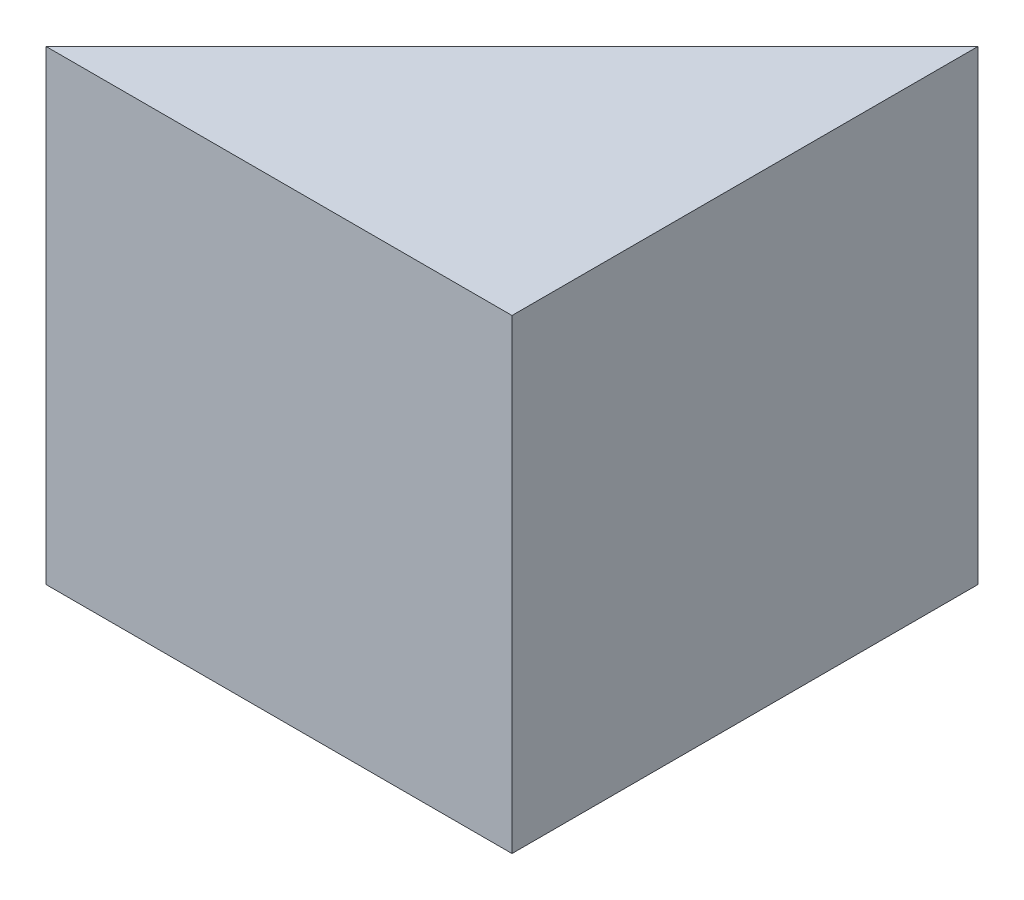
ISO-10303-21;
HEADER;
FILE_DESCRIPTION(('STEP AP214'),'2;1');
FILE_NAME('part.step','',(''),(''),'','','');
FILE_SCHEMA(('AUTOMOTIVE_DESIGN { 1 0 10303 214 1 1 1 1 }'));
ENDSEC;
DATA;
#1=APPLICATION_CONTEXT('core data for automotive mechanical design processes');
#2=APPLICATION_PROTOCOL_DEFINITION('international standard','automotive_design',2000,#1);
#3=PRODUCT_CONTEXT('',#1,'mechanical');
#4=PRODUCT('Part','Part','',(#3));
#5=PRODUCT_RELATED_PRODUCT_CATEGORY('part','',(#4));
#6=PRODUCT_DEFINITION_FORMATION('','',#4);
#7=PRODUCT_DEFINITION_CONTEXT('part definition',#1,'design');
#8=PRODUCT_DEFINITION('design','',#6,#7);
#9=PRODUCT_DEFINITION_SHAPE('','',#8);
#10=(LENGTH_UNIT() NAMED_UNIT(*) SI_UNIT(.MILLI.,.METRE.));
#11=(NAMED_UNIT(*) PLANE_ANGLE_UNIT() SI_UNIT($,.RADIAN.));
#12=(NAMED_UNIT(*) SI_UNIT($,.STERADIAN.) SOLID_ANGLE_UNIT());
#13=UNCERTAINTY_MEASURE_WITH_UNIT(LENGTH_MEASURE(1.E-05),#10,'distance_accuracy_value','');
#14=(GEOMETRIC_REPRESENTATION_CONTEXT(3) GLOBAL_UNCERTAINTY_ASSIGNED_CONTEXT((#13)) GLOBAL_UNIT_ASSIGNED_CONTEXT((#10,
#11,#12)) REPRESENTATION_CONTEXT('',''));
#15=CARTESIAN_POINT('',(0.,0.,0.));
#16=DIRECTION('',(0.,0.,1.));
#17=DIRECTION('',(1.,0.,0.));
#18=AXIS2_PLACEMENT_3D('',#15,#16,#17);
#19=CARTESIAN_POINT('',(0.,6.35,0.));
#20=DIRECTION('',(0.,0.,-1.));
#21=DIRECTION('',(-1.,0.,0.));
#22=AXIS2_PLACEMENT_3D('',#19,#20,#21);
#23=PLANE('',#22);
#24=DIRECTION('',(1.,0.,0.));
#25=VECTOR('',#24,1.);
#26=CARTESIAN_POINT('',(0.,0.,0.));
#27=LINE('',#26,#25);
#28=CARTESIAN_POINT('',(0.,0.,0.));
#29=VERTEX_POINT('',#28);
#30=CARTESIAN_POINT('',(6.35,0.,0.));
#31=VERTEX_POINT('',#30);
#32=EDGE_CURVE('E79',#29,#31,#27,.T.);
#33=ORIENTED_EDGE('',*,*,#32,.T.);
#34=DIRECTION('',(0.,-1.,0.));
#35=VECTOR('',#34,1.);
#36=CARTESIAN_POINT('',(6.35,6.35,0.));
#37=LINE('',#36,#35);
#38=CARTESIAN_POINT('',(6.35,6.35,0.));
#39=VERTEX_POINT('',#38);
#40=EDGE_CURVE('E11',#39,#31,#37,.T.);
#41=ORIENTED_EDGE('',*,*,#40,.F.);
#42=DIRECTION('',(1.,0.,0.));
#43=VECTOR('',#42,1.);
#44=CARTESIAN_POINT('',(0.,6.35,0.));
#45=LINE('',#44,#43);
#46=CARTESIAN_POINT('',(0.,6.35,0.));
#47=VERTEX_POINT('',#46);
#48=EDGE_CURVE('E74',#47,#39,#45,.T.);
#49=ORIENTED_EDGE('',*,*,#48,.F.);
#50=DIRECTION('',(0.,-1.,0.));
#51=VECTOR('',#50,1.);
#52=CARTESIAN_POINT('',(0.,6.35,0.));
#53=LINE('',#52,#51);
#54=EDGE_CURVE('E49',#47,#29,#53,.T.);
#55=ORIENTED_EDGE('',*,*,#54,.T.);
#56=EDGE_LOOP('',(#33,#41,#49,#55));
#57=FACE_BOUND('',#56,.T.);
#58=ADVANCED_FACE('F33',(#57),#23,.F.);
#59=CARTESIAN_POINT('',(6.35,6.35,0.));
#60=DIRECTION('',(-1.,0.,0.));
#61=DIRECTION('',(0.,0.,1.));
#62=AXIS2_PLACEMENT_3D('',#59,#60,#61);
#63=PLANE('',#62);
#64=DIRECTION('',(0.,0.,-1.));
#65=VECTOR('',#64,1.);
#66=CARTESIAN_POINT('',(6.35,0.,0.));
#67=LINE('',#66,#65);
#68=CARTESIAN_POINT('',(6.35,0.,-6.35));
#69=VERTEX_POINT('',#68);
#70=EDGE_CURVE('E82',#31,#69,#67,.T.);
#71=ORIENTED_EDGE('',*,*,#70,.T.);
#72=DIRECTION('',(0.,-1.,0.));
#73=VECTOR('',#72,1.);
#74=CARTESIAN_POINT('',(6.35,6.35,-6.35));
#75=LINE('',#74,#73);
#76=CARTESIAN_POINT('',(6.35,6.35,-6.35));
#77=VERTEX_POINT('',#76);
#78=EDGE_CURVE('E41',#77,#69,#75,.T.);
#79=ORIENTED_EDGE('',*,*,#78,.F.);
#80=DIRECTION('',(0.,0.,-1.));
#81=VECTOR('',#80,1.);
#82=CARTESIAN_POINT('',(6.35,6.35,0.));
#83=LINE('',#82,#81);
#84=EDGE_CURVE('E67',#39,#77,#83,.T.);
#85=ORIENTED_EDGE('',*,*,#84,.F.);
#86=ORIENTED_EDGE('',*,*,#40,.T.);
#87=EDGE_LOOP('',(#71,#79,#85,#86));
#88=FACE_BOUND('',#87,.T.);
#89=ADVANCED_FACE('F69',(#88),#63,.F.);
#90=CARTESIAN_POINT('',(0.,6.35,0.));
#91=DIRECTION('',(-0.707106781186548,0.,-0.707106781186547));
#92=DIRECTION('',(-0.707106781186547,0.,0.707106781186548));
#93=AXIS2_PLACEMENT_3D('',#90,#91,#92);
#94=PLANE('',#93);
#95=DIRECTION('',(0.707106781186547,0.,-0.707106781186548));
#96=VECTOR('',#95,1.);
#97=CARTESIAN_POINT('',(0.,0.,0.));
#98=LINE('',#97,#96);
#99=EDGE_CURVE('E77',#29,#69,#98,.T.);
#100=ORIENTED_EDGE('',*,*,#99,.F.);
#101=ORIENTED_EDGE('',*,*,#54,.F.);
#102=DIRECTION('',(0.707106781186547,0.,-0.707106781186548));
#103=VECTOR('',#102,1.);
#104=CARTESIAN_POINT('',(0.,6.35,0.));
#105=LINE('',#104,#103);
#106=EDGE_CURVE('E73',#47,#77,#105,.T.);
#107=ORIENTED_EDGE('',*,*,#106,.T.);
#108=ORIENTED_EDGE('',*,*,#78,.T.);
#109=EDGE_LOOP('',(#100,#101,#107,#108));
#110=FACE_BOUND('',#109,.T.);
#111=ADVANCED_FACE('F88',(#110),#94,.T.);
#112=CARTESIAN_POINT('',(0.,6.35,0.));
#113=DIRECTION('',(0.,1.,0.));
#114=DIRECTION('',(0.,0.,1.));
#115=AXIS2_PLACEMENT_3D('',#112,#113,#114);
#116=PLANE('',#115);
#117=ORIENTED_EDGE('',*,*,#48,.T.);
#118=ORIENTED_EDGE('',*,*,#84,.T.);
#119=ORIENTED_EDGE('',*,*,#106,.F.);
#120=EDGE_LOOP('',(#117,#118,#119));
#121=FACE_BOUND('',#120,.T.);
#122=ADVANCED_FACE('F76',(#121),#116,.T.);
#123=CARTESIAN_POINT('',(0.,0.,0.));
#124=DIRECTION('',(0.,1.,0.));
#125=DIRECTION('',(0.,0.,1.));
#126=AXIS2_PLACEMENT_3D('',#123,#124,#125);
#127=PLANE('',#126);
#128=ORIENTED_EDGE('',*,*,#32,.F.);
#129=ORIENTED_EDGE('',*,*,#99,.T.);
#130=ORIENTED_EDGE('',*,*,#70,.F.);
#131=EDGE_LOOP('',(#128,#129,#130));
#132=FACE_BOUND('',#131,.T.);
#133=ADVANCED_FACE('F95',(#132),#127,.F.);
#134=CLOSED_SHELL('',(#58,#89,#111,#122,#133));
#135=MANIFOLD_SOLID_BREP('B2',#134);
#136=ADVANCED_BREP_SHAPE_REPRESENTATION('',(#18,#135),#14);
#137=SHAPE_DEFINITION_REPRESENTATION(#9,#136);
ENDSEC;
END-ISO-10303-21;
